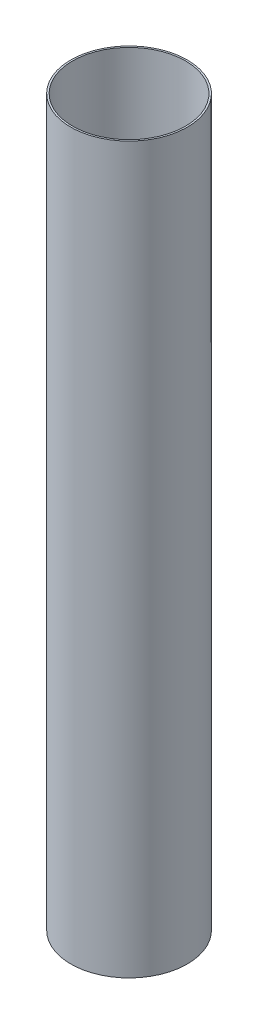
ISO-10303-21;
HEADER;
FILE_DESCRIPTION(('STEP AP214'),'2;1');
FILE_NAME('part.step','',(''),(''),'','','');
FILE_SCHEMA(('AUTOMOTIVE_DESIGN { 1 0 10303 214 1 1 1 1 }'));
ENDSEC;
DATA;
#1=APPLICATION_CONTEXT('core data for automotive mechanical design processes');
#2=APPLICATION_PROTOCOL_DEFINITION('international standard','automotive_design',2000,#1);
#3=PRODUCT_CONTEXT('',#1,'mechanical');
#4=PRODUCT('Part','Part','',(#3));
#5=PRODUCT_RELATED_PRODUCT_CATEGORY('part','',(#4));
#6=PRODUCT_DEFINITION_FORMATION('','',#4);
#7=PRODUCT_DEFINITION_CONTEXT('part definition',#1,'design');
#8=PRODUCT_DEFINITION('design','',#6,#7);
#9=PRODUCT_DEFINITION_SHAPE('','',#8);
#10=(LENGTH_UNIT() NAMED_UNIT(*) SI_UNIT(.MILLI.,.METRE.));
#11=(NAMED_UNIT(*) PLANE_ANGLE_UNIT() SI_UNIT($,.RADIAN.));
#12=(NAMED_UNIT(*) SI_UNIT($,.STERADIAN.) SOLID_ANGLE_UNIT());
#13=UNCERTAINTY_MEASURE_WITH_UNIT(LENGTH_MEASURE(1.E-05),#10,'distance_accuracy_value','');
#14=(GEOMETRIC_REPRESENTATION_CONTEXT(3) GLOBAL_UNCERTAINTY_ASSIGNED_CONTEXT((#13)) GLOBAL_UNIT_ASSIGNED_CONTEXT((#10,
#11,#12)) REPRESENTATION_CONTEXT('',''));
#15=CARTESIAN_POINT('',(0.,0.,0.));
#16=DIRECTION('',(0.,0.,1.));
#17=DIRECTION('',(1.,0.,0.));
#18=AXIS2_PLACEMENT_3D('',#15,#16,#17);
#19=CARTESIAN_POINT('',(0.,785.,-2.74081285099186E-12));
#20=DIRECTION('',(0.,1.,0.));
#21=DIRECTION('',(0.,0.,1.));
#22=AXIS2_PLACEMENT_3D('',#19,#20,#21);
#23=PLANE('',#22);
#24=CARTESIAN_POINT('',(0.,785.,-2.74081285099186E-12));
#25=DIRECTION('',(0.,1.,0.));
#26=DIRECTION('',(0.,0.,1.));
#27=AXIS2_PLACEMENT_3D('',#24,#25,#26);
#28=CIRCLE('',#27,51.054);
#29=CARTESIAN_POINT('',(0.,785.,-51.0540000000027));
#30=VERTEX_POINT('',#29);
#31=EDGE_CURVE('E11',#30,#30,#28,.T.);
#32=ORIENTED_EDGE('',*,*,#31,.T.);
#33=EDGE_LOOP('',(#32));
#34=FACE_BOUND('',#33,.T.);
#35=CARTESIAN_POINT('',(0.,785.,-2.74081285099186E-12));
#36=DIRECTION('',(0.,1.,0.));
#37=DIRECTION('',(0.,0.,1.));
#38=AXIS2_PLACEMENT_3D('',#35,#36,#37);
#39=CIRCLE('',#38,49.53);
#40=CARTESIAN_POINT('',(0.,785.,-49.5300000000027));
#41=VERTEX_POINT('',#40);
#42=EDGE_CURVE('E62',#41,#41,#39,.T.);
#43=ORIENTED_EDGE('',*,*,#42,.F.);
#44=EDGE_LOOP('',(#43));
#45=FACE_BOUND('',#44,.T.);
#46=ADVANCED_FACE('F51',(#34,#45),#23,.T.);
#47=CARTESIAN_POINT('',(0.,150.,-5.2372220082647E-13));
#48=DIRECTION('',(0.,1.,0.));
#49=DIRECTION('',(0.,0.,1.));
#50=AXIS2_PLACEMENT_3D('',#47,#48,#49);
#51=PLANE('',#50);
#52=CARTESIAN_POINT('',(0.,150.,-5.2372220082647E-13));
#53=DIRECTION('',(0.,1.,0.));
#54=DIRECTION('',(0.,0.,1.));
#55=AXIS2_PLACEMENT_3D('',#52,#53,#54);
#56=CIRCLE('',#55,51.054);
#57=CARTESIAN_POINT('',(0.,150.,-51.0540000000005));
#58=VERTEX_POINT('',#57);
#59=EDGE_CURVE('E55',#58,#58,#56,.T.);
#60=ORIENTED_EDGE('',*,*,#59,.F.);
#61=EDGE_LOOP('',(#60));
#62=FACE_BOUND('',#61,.T.);
#63=CARTESIAN_POINT('',(0.,150.,-5.2372220082647E-13));
#64=DIRECTION('',(0.,1.,0.));
#65=DIRECTION('',(0.,0.,1.));
#66=AXIS2_PLACEMENT_3D('',#63,#64,#65);
#67=CIRCLE('',#66,49.53);
#68=CARTESIAN_POINT('',(0.,150.,-49.5300000000005));
#69=VERTEX_POINT('',#68);
#70=EDGE_CURVE('E64',#69,#69,#67,.T.);
#71=ORIENTED_EDGE('',*,*,#70,.T.);
#72=EDGE_LOOP('',(#71));
#73=FACE_BOUND('',#72,.T.);
#74=ADVANCED_FACE('F74',(#62,#73),#51,.F.);
#75=CARTESIAN_POINT('',(0.,785.,-2.74081285099186E-12));
#76=DIRECTION('',(0.,-1.,0.));
#77=DIRECTION('',(0.,0.,-1.));
#78=AXIS2_PLACEMENT_3D('',#75,#76,#77);
#79=CYLINDRICAL_SURFACE('',#78,51.054);
#80=CARTESIAN_POINT('',(0.,785.,-51.0540000000027));
#81=CARTESIAN_POINT('',(0.,778.385416666667,-51.0540000000027));
#82=CARTESIAN_POINT('',(0.,771.770833333333,-51.0540000000027));
#83=CARTESIAN_POINT('',(0.,758.541666666667,-51.0540000000026));
#84=CARTESIAN_POINT('',(0.,751.927083333333,-51.0540000000026));
#85=CARTESIAN_POINT('',(0.,738.697916666667,-51.0540000000026));
#86=CARTESIAN_POINT('',(0.,732.083333333333,-51.0540000000025));
#87=CARTESIAN_POINT('',(0.,718.854166666667,-51.0540000000025));
#88=CARTESIAN_POINT('',(0.,712.239583333333,-51.0540000000025));
#89=CARTESIAN_POINT('',(0.,699.010416666667,-51.0540000000024));
#90=CARTESIAN_POINT('',(0.,692.395833333333,-51.0540000000024));
#91=CARTESIAN_POINT('',(0.,679.166666666667,-51.0540000000024));
#92=CARTESIAN_POINT('',(0.,672.552083333333,-51.0540000000023));
#93=CARTESIAN_POINT('',(0.,659.322916666667,-51.0540000000023));
#94=CARTESIAN_POINT('',(0.,652.708333333333,-51.0540000000023));
#95=CARTESIAN_POINT('',(0.,639.479166666667,-51.0540000000022));
#96=CARTESIAN_POINT('',(0.,632.864583333333,-51.0540000000022));
#97=CARTESIAN_POINT('',(0.,619.635416666667,-51.0540000000022));
#98=CARTESIAN_POINT('',(0.,613.020833333333,-51.0540000000021));
#99=CARTESIAN_POINT('',(0.,599.791666666667,-51.0540000000021));
#100=CARTESIAN_POINT('',(0.,593.177083333333,-51.0540000000021));
#101=CARTESIAN_POINT('',(0.,579.947916666667,-51.054000000002));
#102=CARTESIAN_POINT('',(0.,573.333333333333,-51.054000000002));
#103=CARTESIAN_POINT('',(0.,560.104166666667,-51.0540000000019));
#104=CARTESIAN_POINT('',(0.,553.489583333333,-51.0540000000019));
#105=CARTESIAN_POINT('',(0.,540.260416666667,-51.0540000000019));
#106=CARTESIAN_POINT('',(0.,533.645833333333,-51.0540000000019));
#107=CARTESIAN_POINT('',(0.,520.416666666667,-51.0540000000018));
#108=CARTESIAN_POINT('',(0.,513.802083333333,-51.0540000000018));
#109=CARTESIAN_POINT('',(0.,500.572916666667,-51.0540000000017));
#110=CARTESIAN_POINT('',(0.,493.958333333333,-51.0540000000017));
#111=CARTESIAN_POINT('',(0.,480.729166666667,-51.0540000000017));
#112=CARTESIAN_POINT('',(0.,474.114583333333,-51.0540000000016));
#113=CARTESIAN_POINT('',(0.,460.885416666667,-51.0540000000016));
#114=CARTESIAN_POINT('',(0.,454.270833333333,-51.0540000000016));
#115=CARTESIAN_POINT('',(0.,441.041666666667,-51.0540000000015));
#116=CARTESIAN_POINT('',(0.,434.427083333333,-51.0540000000015));
#117=CARTESIAN_POINT('',(0.,421.197916666667,-51.0540000000015));
#118=CARTESIAN_POINT('',(0.,414.583333333333,-51.0540000000014));
#119=CARTESIAN_POINT('',(0.,401.354166666667,-51.0540000000014));
#120=CARTESIAN_POINT('',(0.,394.739583333333,-51.0540000000014));
#121=CARTESIAN_POINT('',(0.,381.510416666667,-51.0540000000013));
#122=CARTESIAN_POINT('',(0.,374.895833333333,-51.0540000000013));
#123=CARTESIAN_POINT('',(0.,361.666666666667,-51.0540000000013));
#124=CARTESIAN_POINT('',(0.,355.052083333333,-51.0540000000012));
#125=CARTESIAN_POINT('',(0.,341.822916666667,-51.0540000000012));
#126=CARTESIAN_POINT('',(0.,335.208333333333,-51.0540000000012));
#127=CARTESIAN_POINT('',(0.,321.979166666667,-51.0540000000011));
#128=CARTESIAN_POINT('',(0.,315.364583333333,-51.0540000000011));
#129=CARTESIAN_POINT('',(0.,302.135416666667,-51.054000000001));
#130=CARTESIAN_POINT('',(0.,295.520833333333,-51.054000000001));
#131=CARTESIAN_POINT('',(0.,282.291666666667,-51.054000000001));
#132=CARTESIAN_POINT('',(0.,275.677083333333,-51.054000000001));
#133=CARTESIAN_POINT('',(0.,262.447916666667,-51.0540000000009));
#134=CARTESIAN_POINT('',(0.,255.833333333333,-51.0540000000009));
#135=CARTESIAN_POINT('',(0.,242.604166666667,-51.0540000000008));
#136=CARTESIAN_POINT('',(0.,235.989583333333,-51.0540000000008));
#137=CARTESIAN_POINT('',(0.,222.760416666667,-51.0540000000008));
#138=CARTESIAN_POINT('',(0.,216.145833333333,-51.0540000000007));
#139=CARTESIAN_POINT('',(0.,202.916666666667,-51.0540000000007));
#140=CARTESIAN_POINT('',(0.,196.302083333333,-51.0540000000007));
#141=CARTESIAN_POINT('',(0.,183.072916666667,-51.0540000000006));
#142=CARTESIAN_POINT('',(0.,176.458333333333,-51.0540000000006));
#143=CARTESIAN_POINT('',(0.,163.229166666667,-51.0540000000006));
#144=CARTESIAN_POINT('',(0.,156.614583333333,-51.0540000000005));
#145=CARTESIAN_POINT('',(0.,150.,-51.0540000000005));
#146=B_SPLINE_CURVE_WITH_KNOTS('',3,(#80,#81,#82,#83,#84,#85,#86,#87,#88,#89,#90,#91,#92,#93,
#94,#95,#96,#97,#98,#99,#100,#101,#102,#103,#104,#105,#106,#107,#108,#109,#110,#111,#112,#113,
#114,#115,#116,#117,#118,#119,#120,#121,#122,#123,#124,#125,#126,#127,#128,#129,#130,#131,#132,
#133,#134,#135,#136,#137,#138,#139,#140,#141,#142,#143,#144,#145),.UNSPECIFIED.,.F.,.F.,(4,2,2,
2,2,2,2,2,2,2,2,2,2,2,2,2,2,2,2,2,2,2,2,2,2,2,2,2,2,2,2,2,4),(0.,19.84375,39.6875000000001,
59.53125,79.3750000000001,99.21875,119.0625,138.90625,158.75,178.59375,198.4375,218.28125,
238.125,257.96875,277.8125,297.65625,317.5,337.34375,357.1875,377.03125,396.875,416.71875,
436.5625,456.40625,476.25,496.09375,515.9375,535.78125,555.625,575.46875,595.3125,615.15625,
635.),.UNSPECIFIED.);
#147=EDGE_CURVE('BSEAM53',#30,#58,#146,.T.);
#148=ORIENTED_EDGE('',*,*,#31,.F.);
#149=ORIENTED_EDGE('',*,*,#59,.T.);
#150=ORIENTED_EDGE('',*,*,#147,.T.);
#151=ORIENTED_EDGE('',*,*,#147,.F.);
#152=EDGE_LOOP('',(#148,#150,#149,#151));
#153=FACE_BOUND('',#152,.T.);
#154=ADVANCED_FACE('F53',(#153),#79,.T.);
#155=CARTESIAN_POINT('',(0.,785.,-2.74081285099186E-12));
#156=DIRECTION('',(0.,-1.,0.));
#157=DIRECTION('',(0.,0.,-1.));
#158=AXIS2_PLACEMENT_3D('',#155,#156,#157);
#159=CYLINDRICAL_SURFACE('',#158,49.53);
#160=CARTESIAN_POINT('',(0.,785.,-49.5300000000027));
#161=CARTESIAN_POINT('',(0.,778.385416666667,-49.5300000000027));
#162=CARTESIAN_POINT('',(0.,771.770833333333,-49.5300000000027));
#163=CARTESIAN_POINT('',(0.,758.541666666667,-49.5300000000027));
#164=CARTESIAN_POINT('',(0.,751.927083333333,-49.5300000000026));
#165=CARTESIAN_POINT('',(0.,738.697916666667,-49.5300000000026));
#166=CARTESIAN_POINT('',(0.,732.083333333333,-49.5300000000026));
#167=CARTESIAN_POINT('',(0.,718.854166666667,-49.5300000000025));
#168=CARTESIAN_POINT('',(0.,712.239583333333,-49.5300000000025));
#169=CARTESIAN_POINT('',(0.,699.010416666667,-49.5300000000024));
#170=CARTESIAN_POINT('',(0.,692.395833333333,-49.5300000000024));
#171=CARTESIAN_POINT('',(0.,679.166666666667,-49.5300000000024));
#172=CARTESIAN_POINT('',(0.,672.552083333333,-49.5300000000023));
#173=CARTESIAN_POINT('',(0.,659.322916666667,-49.5300000000023));
#174=CARTESIAN_POINT('',(0.,652.708333333333,-49.5300000000023));
#175=CARTESIAN_POINT('',(0.,639.479166666667,-49.5300000000022));
#176=CARTESIAN_POINT('',(0.,632.864583333333,-49.5300000000022));
#177=CARTESIAN_POINT('',(0.,619.635416666667,-49.5300000000022));
#178=CARTESIAN_POINT('',(0.,613.020833333333,-49.5300000000021));
#179=CARTESIAN_POINT('',(0.,599.791666666667,-49.5300000000021));
#180=CARTESIAN_POINT('',(0.,593.177083333333,-49.5300000000021));
#181=CARTESIAN_POINT('',(0.,579.947916666667,-49.530000000002));
#182=CARTESIAN_POINT('',(0.,573.333333333333,-49.530000000002));
#183=CARTESIAN_POINT('',(0.,560.104166666667,-49.530000000002));
#184=CARTESIAN_POINT('',(0.,553.489583333333,-49.5300000000019));
#185=CARTESIAN_POINT('',(0.,540.260416666667,-49.5300000000019));
#186=CARTESIAN_POINT('',(0.,533.645833333333,-49.5300000000019));
#187=CARTESIAN_POINT('',(0.,520.416666666667,-49.5300000000018));
#188=CARTESIAN_POINT('',(0.,513.802083333333,-49.5300000000018));
#189=CARTESIAN_POINT('',(0.,500.572916666667,-49.5300000000017));
#190=CARTESIAN_POINT('',(0.,493.958333333333,-49.5300000000017));
#191=CARTESIAN_POINT('',(0.,480.729166666667,-49.5300000000017));
#192=CARTESIAN_POINT('',(0.,474.114583333333,-49.5300000000016));
#193=CARTESIAN_POINT('',(0.,460.885416666667,-49.5300000000016));
#194=CARTESIAN_POINT('',(0.,454.270833333333,-49.5300000000016));
#195=CARTESIAN_POINT('',(0.,441.041666666667,-49.5300000000015));
#196=CARTESIAN_POINT('',(0.,434.427083333333,-49.5300000000015));
#197=CARTESIAN_POINT('',(0.,421.197916666667,-49.5300000000015));
#198=CARTESIAN_POINT('',(0.,414.583333333333,-49.5300000000014));
#199=CARTESIAN_POINT('',(0.,401.354166666667,-49.5300000000014));
#200=CARTESIAN_POINT('',(0.,394.739583333333,-49.5300000000014));
#201=CARTESIAN_POINT('',(0.,381.510416666667,-49.5300000000013));
#202=CARTESIAN_POINT('',(0.,374.895833333333,-49.5300000000013));
#203=CARTESIAN_POINT('',(0.,361.666666666667,-49.5300000000013));
#204=CARTESIAN_POINT('',(0.,355.052083333333,-49.5300000000012));
#205=CARTESIAN_POINT('',(0.,341.822916666667,-49.5300000000012));
#206=CARTESIAN_POINT('',(0.,335.208333333333,-49.5300000000012));
#207=CARTESIAN_POINT('',(0.,321.979166666667,-49.5300000000011));
#208=CARTESIAN_POINT('',(0.,315.364583333333,-49.5300000000011));
#209=CARTESIAN_POINT('',(0.,302.135416666667,-49.5300000000011));
#210=CARTESIAN_POINT('',(0.,295.520833333333,-49.530000000001));
#211=CARTESIAN_POINT('',(0.,282.291666666667,-49.530000000001));
#212=CARTESIAN_POINT('',(0.,275.677083333333,-49.530000000001));
#213=CARTESIAN_POINT('',(0.,262.447916666667,-49.5300000000009));
#214=CARTESIAN_POINT('',(0.,255.833333333333,-49.5300000000009));
#215=CARTESIAN_POINT('',(0.,242.604166666667,-49.5300000000008));
#216=CARTESIAN_POINT('',(0.,235.989583333333,-49.5300000000008));
#217=CARTESIAN_POINT('',(0.,222.760416666667,-49.5300000000008));
#218=CARTESIAN_POINT('',(0.,216.145833333333,-49.5300000000007));
#219=CARTESIAN_POINT('',(0.,202.916666666667,-49.5300000000007));
#220=CARTESIAN_POINT('',(0.,196.302083333333,-49.5300000000007));
#221=CARTESIAN_POINT('',(0.,183.072916666667,-49.5300000000006));
#222=CARTESIAN_POINT('',(0.,176.458333333333,-49.5300000000006));
#223=CARTESIAN_POINT('',(0.,163.229166666667,-49.5300000000006));
#224=CARTESIAN_POINT('',(0.,156.614583333333,-49.5300000000005));
#225=CARTESIAN_POINT('',(0.,150.,-49.5300000000005));
#226=B_SPLINE_CURVE_WITH_KNOTS('',3,(#160,#161,#162,#163,#164,#165,#166,#167,#168,#169,#170,
#171,#172,#173,#174,#175,#176,#177,#178,#179,#180,#181,#182,#183,#184,#185,#186,#187,#188,#189,
#190,#191,#192,#193,#194,#195,#196,#197,#198,#199,#200,#201,#202,#203,#204,#205,#206,#207,#208,
#209,#210,#211,#212,#213,#214,#215,#216,#217,#218,#219,#220,#221,#222,#223,#224,#225),
.UNSPECIFIED.,.F.,.F.,(4,2,2,2,2,2,2,2,2,2,2,2,2,2,2,2,2,2,2,2,2,2,2,2,2,2,2,2,2,2,2,2,4),(0.,
19.8437499999999,39.6875,59.5312499999999,79.375,99.2187499999999,119.0625,138.90625,158.75,
178.59375,198.4375,218.28125,238.125,257.96875,277.8125,297.65625,317.5,337.34375,357.1875,
377.03125,396.875,416.71875,436.5625,456.40625,476.25,496.09375,515.9375,535.78125,555.625,
575.46875,595.3125,615.15625,635.),.UNSPECIFIED.);
#227=EDGE_CURVE('BSEAM70',#41,#69,#226,.T.);
#228=ORIENTED_EDGE('',*,*,#42,.T.);
#229=ORIENTED_EDGE('',*,*,#70,.F.);
#230=ORIENTED_EDGE('',*,*,#227,.T.);
#231=ORIENTED_EDGE('',*,*,#227,.F.);
#232=EDGE_LOOP('',(#228,#230,#229,#231));
#233=FACE_BOUND('',#232,.T.);
#234=ADVANCED_FACE('F70',(#233),#159,.F.);
#235=CLOSED_SHELL('',(#46,#74,#154,#234));
#236=MANIFOLD_SOLID_BREP('B2',#235);
#237=ADVANCED_BREP_SHAPE_REPRESENTATION('',(#18,#236),#14);
#238=SHAPE_DEFINITION_REPRESENTATION(#9,#237);
ENDSEC;
END-ISO-10303-21;
